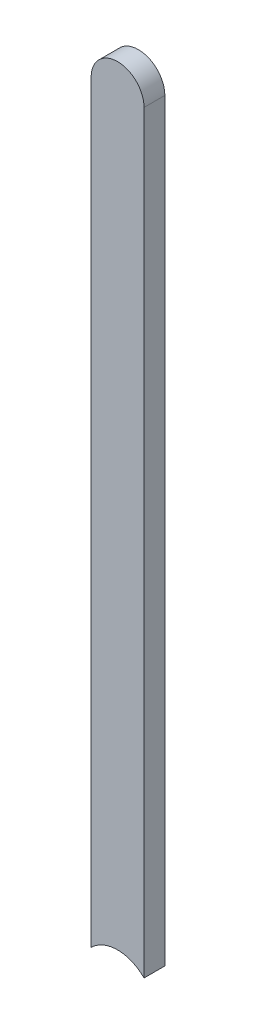
ISO-10303-21;
HEADER;
FILE_DESCRIPTION(('STEP AP214'),'2;1');
FILE_NAME('part.step','',(''),(''),'','','');
FILE_SCHEMA(('AUTOMOTIVE_DESIGN { 1 0 10303 214 1 1 1 1 }'));
ENDSEC;
DATA;
#1=APPLICATION_CONTEXT('core data for automotive mechanical design processes');
#2=APPLICATION_PROTOCOL_DEFINITION('international standard','automotive_design',2000,#1);
#3=PRODUCT_CONTEXT('',#1,'mechanical');
#4=PRODUCT('Part','Part','',(#3));
#5=PRODUCT_RELATED_PRODUCT_CATEGORY('part','',(#4));
#6=PRODUCT_DEFINITION_FORMATION('','',#4);
#7=PRODUCT_DEFINITION_CONTEXT('part definition',#1,'design');
#8=PRODUCT_DEFINITION('design','',#6,#7);
#9=PRODUCT_DEFINITION_SHAPE('','',#8);
#10=(LENGTH_UNIT() NAMED_UNIT(*) SI_UNIT(.MILLI.,.METRE.));
#11=(NAMED_UNIT(*) PLANE_ANGLE_UNIT() SI_UNIT($,.RADIAN.));
#12=(NAMED_UNIT(*) SI_UNIT($,.STERADIAN.) SOLID_ANGLE_UNIT());
#13=UNCERTAINTY_MEASURE_WITH_UNIT(LENGTH_MEASURE(1.E-05),#10,'distance_accuracy_value','');
#14=(GEOMETRIC_REPRESENTATION_CONTEXT(3) GLOBAL_UNCERTAINTY_ASSIGNED_CONTEXT((#13)) GLOBAL_UNIT_ASSIGNED_CONTEXT((#10,
#11,#12)) REPRESENTATION_CONTEXT('',''));
#15=CARTESIAN_POINT('',(0.,0.,0.));
#16=DIRECTION('',(0.,0.,1.));
#17=DIRECTION('',(1.,0.,0.));
#18=AXIS2_PLACEMENT_3D('',#15,#16,#17);
#19=CARTESIAN_POINT('',(136.398,73.6548681578668,0.));
#20=DIRECTION('',(-1.,0.,0.));
#21=DIRECTION('',(0.,1.,0.));
#22=AXIS2_PLACEMENT_3D('',#19,#20,#21);
#23=PLANE('',#22);
#24=DIRECTION('',(0.,1.,0.));
#25=VECTOR('',#24,1.);
#26=CARTESIAN_POINT('',(136.398,73.406,0.1999996));
#27=LINE('',#26,#25);
#28=CARTESIAN_POINT('',(136.398,73.6548681578668,0.1999996));
#29=VERTEX_POINT('',#28);
#30=CARTESIAN_POINT('',(136.398,80.8960028,0.1999996));
#31=VERTEX_POINT('',#30);
#32=EDGE_CURVE('E11',#29,#31,#27,.T.);
#33=ORIENTED_EDGE('',*,*,#32,.F.);
#34=DIRECTION('',(0.,0.,1.));
#35=VECTOR('',#34,1.);
#36=CARTESIAN_POINT('',(136.398,73.6548681578668,0.));
#37=LINE('',#36,#35);
#38=CARTESIAN_POINT('',(136.398,73.6548681578668,0.));
#39=VERTEX_POINT('',#38);
#40=EDGE_CURVE('E24',#39,#29,#37,.T.);
#41=ORIENTED_EDGE('',*,*,#40,.F.);
#42=DIRECTION('',(0.,1.,0.));
#43=VECTOR('',#42,1.);
#44=CARTESIAN_POINT('',(136.398,73.406,0.));
#45=LINE('',#44,#43);
#46=CARTESIAN_POINT('',(136.398,80.8960028,0.));
#47=VERTEX_POINT('',#46);
#48=EDGE_CURVE('E75',#39,#47,#45,.T.);
#49=ORIENTED_EDGE('',*,*,#48,.T.);
#50=DIRECTION('',(0.,0.,1.));
#51=VECTOR('',#50,1.);
#52=CARTESIAN_POINT('',(136.398,80.8960028,0.));
#53=LINE('',#52,#51);
#54=EDGE_CURVE('E37',#47,#31,#53,.T.);
#55=ORIENTED_EDGE('',*,*,#54,.T.);
#56=EDGE_LOOP('',(#33,#41,#49,#55));
#57=FACE_BOUND('',#56,.T.);
#58=ADVANCED_FACE('F17',(#57),#23,.F.);
#59=CARTESIAN_POINT('',(136.144,80.8960028,0.));
#60=DIRECTION('',(0.,0.,-1.));
#61=DIRECTION('',(1.,0.,0.));
#62=AXIS2_PLACEMENT_3D('',#59,#60,#61);
#63=CYLINDRICAL_SURFACE('',#62,0.254000000000005);
#64=CARTESIAN_POINT('',(136.144,80.8960028,0.1999996));
#65=DIRECTION('',(0.,0.,1.));
#66=DIRECTION('',(1.,0.,0.));
#67=AXIS2_PLACEMENT_3D('',#64,#65,#66);
#68=CIRCLE('',#67,0.254000000000005);
#69=CARTESIAN_POINT('',(135.89,80.8960028,0.1999996));
#70=VERTEX_POINT('',#69);
#71=EDGE_CURVE('E83',#31,#70,#68,.T.);
#72=ORIENTED_EDGE('',*,*,#71,.F.);
#73=ORIENTED_EDGE('',*,*,#54,.F.);
#74=CARTESIAN_POINT('',(136.144,80.8960028,0.));
#75=DIRECTION('',(0.,0.,1.));
#76=DIRECTION('',(1.,0.,0.));
#77=AXIS2_PLACEMENT_3D('',#74,#75,#76);
#78=CIRCLE('',#77,0.254000000000005);
#79=CARTESIAN_POINT('',(135.89,80.8960028,0.));
#80=VERTEX_POINT('',#79);
#81=EDGE_CURVE('E81',#47,#80,#78,.T.);
#82=ORIENTED_EDGE('',*,*,#81,.T.);
#83=DIRECTION('',(0.,0.,1.));
#84=VECTOR('',#83,1.);
#85=CARTESIAN_POINT('',(135.89,80.8960028,0.));
#86=LINE('',#85,#84);
#87=EDGE_CURVE('E67',#80,#70,#86,.T.);
#88=ORIENTED_EDGE('',*,*,#87,.T.);
#89=EDGE_LOOP('',(#72,#73,#82,#88));
#90=FACE_BOUND('',#89,.T.);
#91=ADVANCED_FACE('F89',(#90),#63,.T.);
#92=CARTESIAN_POINT('',(135.89,80.8960028,0.));
#93=DIRECTION('',(1.,0.,0.));
#94=DIRECTION('',(0.,-1.,0.));
#95=AXIS2_PLACEMENT_3D('',#92,#93,#94);
#96=PLANE('',#95);
#97=DIRECTION('',(0.,-1.,0.));
#98=VECTOR('',#97,1.);
#99=CARTESIAN_POINT('',(135.89,80.8960028,0.1999996));
#100=LINE('',#99,#98);
#101=CARTESIAN_POINT('',(135.89,73.6548681578668,0.1999996));
#102=VERTEX_POINT('',#101);
#103=EDGE_CURVE('E71',#70,#102,#100,.T.);
#104=ORIENTED_EDGE('',*,*,#103,.F.);
#105=ORIENTED_EDGE('',*,*,#87,.F.);
#106=DIRECTION('',(0.,-1.,0.));
#107=VECTOR('',#106,1.);
#108=CARTESIAN_POINT('',(135.89,80.8960028,0.));
#109=LINE('',#108,#107);
#110=CARTESIAN_POINT('',(135.89,73.6548681578668,0.));
#111=VERTEX_POINT('',#110);
#112=EDGE_CURVE('E63',#80,#111,#109,.T.);
#113=ORIENTED_EDGE('',*,*,#112,.T.);
#114=DIRECTION('',(0.,0.,1.));
#115=VECTOR('',#114,1.);
#116=CARTESIAN_POINT('',(135.89,73.6548681578668,0.));
#117=LINE('',#116,#115);
#118=EDGE_CURVE('E53',#111,#102,#117,.T.);
#119=ORIENTED_EDGE('',*,*,#118,.T.);
#120=EDGE_LOOP('',(#104,#105,#113,#119));
#121=FACE_BOUND('',#120,.T.);
#122=ADVANCED_FACE('F66',(#121),#96,.F.);
#123=CARTESIAN_POINT('',(136.144,73.406,0.));
#124=DIRECTION('',(0.,0.,-1.));
#125=DIRECTION('',(1.,0.,0.));
#126=AXIS2_PLACEMENT_3D('',#123,#124,#125);
#127=CYLINDRICAL_SURFACE('',#126,0.3556);
#128=ORIENTED_EDGE('',*,*,#40,.T.);
#129=CARTESIAN_POINT('',(136.144,73.406,0.1999996));
#130=DIRECTION('',(0.,0.,1.));
#131=DIRECTION('',(1.,0.,0.));
#132=AXIS2_PLACEMENT_3D('',#129,#130,#131);
#133=CIRCLE('',#132,0.3556);
#134=EDGE_CURVE('E59',#29,#102,#133,.T.);
#135=ORIENTED_EDGE('',*,*,#134,.T.);
#136=ORIENTED_EDGE('',*,*,#118,.F.);
#137=CARTESIAN_POINT('',(136.144,73.406,0.));
#138=DIRECTION('',(0.,0.,1.));
#139=DIRECTION('',(1.,0.,0.));
#140=AXIS2_PLACEMENT_3D('',#137,#138,#139);
#141=CIRCLE('',#140,0.3556);
#142=EDGE_CURVE('E57',#39,#111,#141,.T.);
#143=ORIENTED_EDGE('',*,*,#142,.F.);
#144=EDGE_LOOP('',(#128,#135,#136,#143));
#145=FACE_BOUND('',#144,.T.);
#146=ADVANCED_FACE('F55',(#145),#127,.F.);
#147=CARTESIAN_POINT('',(136.398,73.406,0.));
#148=DIRECTION('',(0.,0.,-1.));
#149=DIRECTION('',(-1.,0.,0.));
#150=AXIS2_PLACEMENT_3D('',#147,#148,#149);
#151=PLANE('',#150);
#152=ORIENTED_EDGE('',*,*,#48,.F.);
#153=ORIENTED_EDGE('',*,*,#142,.T.);
#154=ORIENTED_EDGE('',*,*,#112,.F.);
#155=ORIENTED_EDGE('',*,*,#81,.F.);
#156=EDGE_LOOP('',(#152,#153,#154,#155));
#157=FACE_BOUND('',#156,.T.);
#158=ADVANCED_FACE('F74',(#157),#151,.T.);
#159=CARTESIAN_POINT('',(136.398,73.406,0.1999996));
#160=DIRECTION('',(0.,0.,-1.));
#161=DIRECTION('',(-1.,0.,0.));
#162=AXIS2_PLACEMENT_3D('',#159,#160,#161);
#163=PLANE('',#162);
#164=ORIENTED_EDGE('',*,*,#134,.F.);
#165=ORIENTED_EDGE('',*,*,#32,.T.);
#166=ORIENTED_EDGE('',*,*,#71,.T.);
#167=ORIENTED_EDGE('',*,*,#103,.T.);
#168=EDGE_LOOP('',(#164,#165,#166,#167));
#169=FACE_BOUND('',#168,.T.);
#170=ADVANCED_FACE('F91',(#169),#163,.F.);
#171=CLOSED_SHELL('',(#58,#91,#122,#146,#158,#170));
#172=MANIFOLD_SOLID_BREP('B1',#171);
#173=ADVANCED_BREP_SHAPE_REPRESENTATION('',(#18,#172),#14);
#174=SHAPE_DEFINITION_REPRESENTATION(#9,#173);
ENDSEC;
END-ISO-10303-21;
